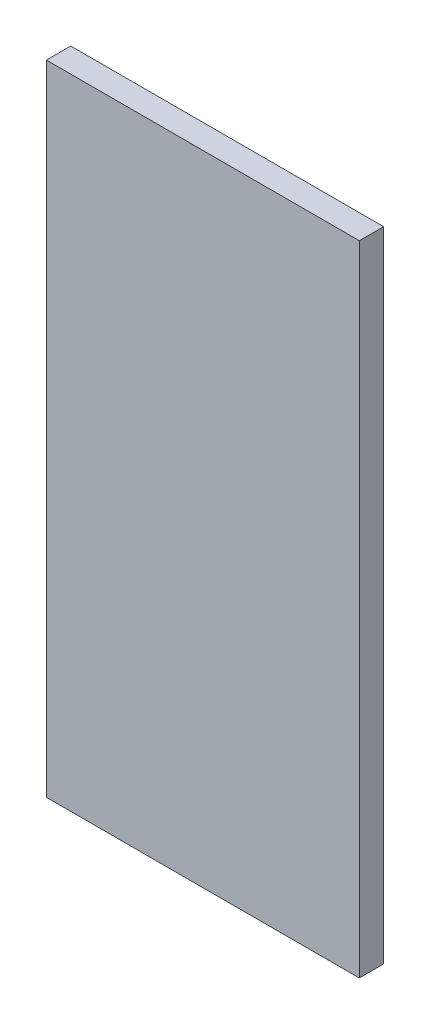
ISO-10303-21;
HEADER;
FILE_DESCRIPTION(('STEP AP214'),'2;1');
FILE_NAME('part.step','',(''),(''),'','','');
FILE_SCHEMA(('AUTOMOTIVE_DESIGN { 1 0 10303 214 1 1 1 1 }'));
ENDSEC;
DATA;
#1=APPLICATION_CONTEXT('core data for automotive mechanical design processes');
#2=APPLICATION_PROTOCOL_DEFINITION('international standard','automotive_design',2000,#1);
#3=PRODUCT_CONTEXT('',#1,'mechanical');
#4=PRODUCT('Part','Part','',(#3));
#5=PRODUCT_RELATED_PRODUCT_CATEGORY('part','',(#4));
#6=PRODUCT_DEFINITION_FORMATION('','',#4);
#7=PRODUCT_DEFINITION_CONTEXT('part definition',#1,'design');
#8=PRODUCT_DEFINITION('design','',#6,#7);
#9=PRODUCT_DEFINITION_SHAPE('','',#8);
#10=(LENGTH_UNIT() NAMED_UNIT(*) SI_UNIT(.MILLI.,.METRE.));
#11=(NAMED_UNIT(*) PLANE_ANGLE_UNIT() SI_UNIT($,.RADIAN.));
#12=(NAMED_UNIT(*) SI_UNIT($,.STERADIAN.) SOLID_ANGLE_UNIT());
#13=UNCERTAINTY_MEASURE_WITH_UNIT(LENGTH_MEASURE(1.E-05),#10,'distance_accuracy_value','');
#14=(GEOMETRIC_REPRESENTATION_CONTEXT(3) GLOBAL_UNCERTAINTY_ASSIGNED_CONTEXT((#13)) GLOBAL_UNIT_ASSIGNED_CONTEXT((#10,
#11,#12)) REPRESENTATION_CONTEXT('',''));
#15=CARTESIAN_POINT('',(0.,0.,0.));
#16=DIRECTION('',(0.,0.,1.));
#17=DIRECTION('',(1.,0.,0.));
#18=AXIS2_PLACEMENT_3D('',#15,#16,#17);
#19=CARTESIAN_POINT('',(-245.05,250.,19.05));
#20=DIRECTION('',(1.,0.,0.));
#21=DIRECTION('',(0.,0.,-1.));
#22=AXIS2_PLACEMENT_3D('',#19,#20,#21);
#23=PLANE('',#22);
#24=DIRECTION('',(0.,-1.,0.));
#25=VECTOR('',#24,1.);
#26=CARTESIAN_POINT('',(-245.05,250.,0.));
#27=LINE('',#26,#25);
#28=CARTESIAN_POINT('',(-245.05,250.,0.));
#29=VERTEX_POINT('',#28);
#30=CARTESIAN_POINT('',(-245.05,-250.,0.));
#31=VERTEX_POINT('',#30);
#32=EDGE_CURVE('E96',#29,#31,#27,.T.);
#33=ORIENTED_EDGE('',*,*,#32,.T.);
#34=DIRECTION('',(0.,0.,-1.));
#35=VECTOR('',#34,1.);
#36=CARTESIAN_POINT('',(-245.05,-250.,19.05));
#37=LINE('',#36,#35);
#38=CARTESIAN_POINT('',(-245.05,-250.,19.05));
#39=VERTEX_POINT('',#38);
#40=EDGE_CURVE('E11',#39,#31,#37,.T.);
#41=ORIENTED_EDGE('',*,*,#40,.F.);
#42=DIRECTION('',(0.,-1.,0.));
#43=VECTOR('',#42,1.);
#44=CARTESIAN_POINT('',(-245.05,250.,19.05));
#45=LINE('',#44,#43);
#46=CARTESIAN_POINT('',(-245.05,250.,19.05));
#47=VERTEX_POINT('',#46);
#48=EDGE_CURVE('E84',#47,#39,#45,.T.);
#49=ORIENTED_EDGE('',*,*,#48,.F.);
#50=DIRECTION('',(0.,0.,-1.));
#51=VECTOR('',#50,1.);
#52=CARTESIAN_POINT('',(-245.05,250.,19.05));
#53=LINE('',#52,#51);
#54=EDGE_CURVE('E92',#47,#29,#53,.T.);
#55=ORIENTED_EDGE('',*,*,#54,.T.);
#56=EDGE_LOOP('',(#33,#41,#49,#55));
#57=FACE_BOUND('',#56,.T.);
#58=ADVANCED_FACE('F33',(#57),#23,.F.);
#59=CARTESIAN_POINT('',(-245.05,-250.,19.05));
#60=DIRECTION('',(0.,1.,0.));
#61=DIRECTION('',(0.,0.,1.));
#62=AXIS2_PLACEMENT_3D('',#59,#60,#61);
#63=PLANE('',#62);
#64=DIRECTION('',(1.,0.,0.));
#65=VECTOR('',#64,1.);
#66=CARTESIAN_POINT('',(-245.05,-250.,0.));
#67=LINE('',#66,#65);
#68=CARTESIAN_POINT('',(0.,-250.,0.));
#69=VERTEX_POINT('',#68);
#70=EDGE_CURVE('E88',#31,#69,#67,.T.);
#71=ORIENTED_EDGE('',*,*,#70,.T.);
#72=DIRECTION('',(0.,0.,-1.));
#73=VECTOR('',#72,1.);
#74=CARTESIAN_POINT('',(0.,-250.,19.05));
#75=LINE('',#74,#73);
#76=CARTESIAN_POINT('',(0.,-250.,19.05));
#77=VERTEX_POINT('',#76);
#78=EDGE_CURVE('E41',#77,#69,#75,.T.);
#79=ORIENTED_EDGE('',*,*,#78,.F.);
#80=DIRECTION('',(1.,0.,0.));
#81=VECTOR('',#80,1.);
#82=CARTESIAN_POINT('',(-245.05,-250.,19.05));
#83=LINE('',#82,#81);
#84=EDGE_CURVE('E79',#39,#77,#83,.T.);
#85=ORIENTED_EDGE('',*,*,#84,.F.);
#86=ORIENTED_EDGE('',*,*,#40,.T.);
#87=EDGE_LOOP('',(#71,#79,#85,#86));
#88=FACE_BOUND('',#87,.T.);
#89=ADVANCED_FACE('F87',(#88),#63,.F.);
#90=CARTESIAN_POINT('',(0.,250.,19.05));
#91=DIRECTION('',(-1.,0.,0.));
#92=DIRECTION('',(0.,0.,1.));
#93=AXIS2_PLACEMENT_3D('',#90,#91,#92);
#94=PLANE('',#93);
#95=DIRECTION('',(0.,1.,0.));
#96=VECTOR('',#95,1.);
#97=CARTESIAN_POINT('',(0.,250.,0.));
#98=LINE('',#97,#96);
#99=CARTESIAN_POINT('',(0.,250.,0.));
#100=VERTEX_POINT('',#99);
#101=EDGE_CURVE('E66',#69,#100,#98,.T.);
#102=ORIENTED_EDGE('',*,*,#101,.T.);
#103=DIRECTION('',(0.,0.,-1.));
#104=VECTOR('',#103,1.);
#105=CARTESIAN_POINT('',(0.,250.,19.05));
#106=LINE('',#105,#104);
#107=CARTESIAN_POINT('',(0.,250.,19.05));
#108=VERTEX_POINT('',#107);
#109=EDGE_CURVE('E89',#108,#100,#106,.T.);
#110=ORIENTED_EDGE('',*,*,#109,.F.);
#111=DIRECTION('',(0.,1.,0.));
#112=VECTOR('',#111,1.);
#113=CARTESIAN_POINT('',(0.,250.,19.05));
#114=LINE('',#113,#112);
#115=EDGE_CURVE('E82',#77,#108,#114,.T.);
#116=ORIENTED_EDGE('',*,*,#115,.F.);
#117=ORIENTED_EDGE('',*,*,#78,.T.);
#118=EDGE_LOOP('',(#102,#110,#116,#117));
#119=FACE_BOUND('',#118,.T.);
#120=ADVANCED_FACE('F90',(#119),#94,.F.);
#121=CARTESIAN_POINT('',(-245.05,250.,19.05));
#122=DIRECTION('',(0.,-1.,0.));
#123=DIRECTION('',(0.,0.,-1.));
#124=AXIS2_PLACEMENT_3D('',#121,#122,#123);
#125=PLANE('',#124);
#126=DIRECTION('',(-1.,0.,0.));
#127=VECTOR('',#126,1.);
#128=CARTESIAN_POINT('',(-245.05,250.,0.));
#129=LINE('',#128,#127);
#130=EDGE_CURVE('E72',#100,#29,#129,.T.);
#131=ORIENTED_EDGE('',*,*,#130,.T.);
#132=ORIENTED_EDGE('',*,*,#54,.F.);
#133=DIRECTION('',(-1.,0.,0.));
#134=VECTOR('',#133,1.);
#135=CARTESIAN_POINT('',(-245.05,250.,19.05));
#136=LINE('',#135,#134);
#137=EDGE_CURVE('E49',#108,#47,#136,.T.);
#138=ORIENTED_EDGE('',*,*,#137,.F.);
#139=ORIENTED_EDGE('',*,*,#109,.T.);
#140=EDGE_LOOP('',(#131,#132,#138,#139));
#141=FACE_BOUND('',#140,.T.);
#142=ADVANCED_FACE('F103',(#141),#125,.F.);
#143=CARTESIAN_POINT('',(0.,0.,19.05));
#144=DIRECTION('',(0.,0.,1.));
#145=DIRECTION('',(1.,0.,0.));
#146=AXIS2_PLACEMENT_3D('',#143,#144,#145);
#147=PLANE('',#146);
#148=ORIENTED_EDGE('',*,*,#48,.T.);
#149=ORIENTED_EDGE('',*,*,#84,.T.);
#150=ORIENTED_EDGE('',*,*,#115,.T.);
#151=ORIENTED_EDGE('',*,*,#137,.T.);
#152=EDGE_LOOP('',(#148,#149,#150,#151));
#153=FACE_BOUND('',#152,.T.);
#154=ADVANCED_FACE('F80',(#153),#147,.T.);
#155=CARTESIAN_POINT('',(0.,0.,0.));
#156=DIRECTION('',(0.,0.,1.));
#157=DIRECTION('',(1.,0.,0.));
#158=AXIS2_PLACEMENT_3D('',#155,#156,#157);
#159=PLANE('',#158);
#160=ORIENTED_EDGE('',*,*,#32,.F.);
#161=ORIENTED_EDGE('',*,*,#130,.F.);
#162=ORIENTED_EDGE('',*,*,#101,.F.);
#163=ORIENTED_EDGE('',*,*,#70,.F.);
#164=EDGE_LOOP('',(#160,#161,#162,#163));
#165=FACE_BOUND('',#164,.T.);
#166=ADVANCED_FACE('F106',(#165),#159,.F.);
#167=CLOSED_SHELL('',(#58,#89,#120,#142,#154,#166));
#168=MANIFOLD_SOLID_BREP('B2',#167);
#169=ADVANCED_BREP_SHAPE_REPRESENTATION('',(#18,#168),#14);
#170=SHAPE_DEFINITION_REPRESENTATION(#9,#169);
ENDSEC;
END-ISO-10303-21;
